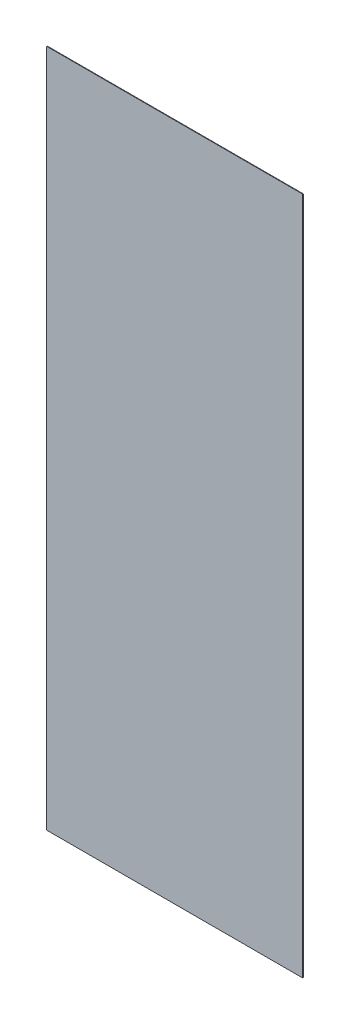
ISO-10303-21;
HEADER;
FILE_DESCRIPTION(('STEP AP214'),'2;1');
FILE_NAME('part.step','',(''),(''),'','','');
FILE_SCHEMA(('AUTOMOTIVE_DESIGN { 1 0 10303 214 1 1 1 1 }'));
ENDSEC;
DATA;
#1=APPLICATION_CONTEXT('core data for automotive mechanical design processes');
#2=APPLICATION_PROTOCOL_DEFINITION('international standard','automotive_design',2000,#1);
#3=PRODUCT_CONTEXT('',#1,'mechanical');
#4=PRODUCT('Part','Part','',(#3));
#5=PRODUCT_RELATED_PRODUCT_CATEGORY('part','',(#4));
#6=PRODUCT_DEFINITION_FORMATION('','',#4);
#7=PRODUCT_DEFINITION_CONTEXT('part definition',#1,'design');
#8=PRODUCT_DEFINITION('design','',#6,#7);
#9=PRODUCT_DEFINITION_SHAPE('','',#8);
#10=(LENGTH_UNIT() NAMED_UNIT(*) SI_UNIT(.MILLI.,.METRE.));
#11=(NAMED_UNIT(*) PLANE_ANGLE_UNIT() SI_UNIT($,.RADIAN.));
#12=(NAMED_UNIT(*) SI_UNIT($,.STERADIAN.) SOLID_ANGLE_UNIT());
#13=UNCERTAINTY_MEASURE_WITH_UNIT(LENGTH_MEASURE(1.E-05),#10,'distance_accuracy_value','');
#14=(GEOMETRIC_REPRESENTATION_CONTEXT(3) GLOBAL_UNCERTAINTY_ASSIGNED_CONTEXT((#13)) GLOBAL_UNIT_ASSIGNED_CONTEXT((#10,
#11,#12)) REPRESENTATION_CONTEXT('',''));
#15=CARTESIAN_POINT('',(0.,0.,0.));
#16=DIRECTION('',(0.,0.,1.));
#17=DIRECTION('',(1.,0.,0.));
#18=AXIS2_PLACEMENT_3D('',#15,#16,#17);
#19=CARTESIAN_POINT('',(1.5,120.,-820.));
#20=DIRECTION('',(-1.,0.,0.));
#21=DIRECTION('',(0.,0.,1.));
#22=AXIS2_PLACEMENT_3D('',#19,#20,#21);
#23=PLANE('',#22);
#24=DIRECTION('',(0.,-1.,0.));
#25=VECTOR('',#24,1.);
#26=CARTESIAN_POINT('',(1.5,120.,-818.5));
#27=LINE('',#26,#25);
#28=CARTESIAN_POINT('',(1.5,1968.5,-818.5));
#29=VERTEX_POINT('',#28);
#30=CARTESIAN_POINT('',(1.5,120.,-818.5));
#31=VERTEX_POINT('',#30);
#32=EDGE_CURVE('E103',#29,#31,#27,.T.);
#33=ORIENTED_EDGE('',*,*,#32,.F.);
#34=DIRECTION('',(0.,0.,1.));
#35=VECTOR('',#34,1.);
#36=CARTESIAN_POINT('',(1.5,1968.5,-820.));
#37=LINE('',#36,#35);
#38=CARTESIAN_POINT('',(1.5,1968.5,-820.));
#39=VERTEX_POINT('',#38);
#40=EDGE_CURVE('E11',#39,#29,#37,.T.);
#41=ORIENTED_EDGE('',*,*,#40,.F.);
#42=DIRECTION('',(0.,-1.,0.));
#43=VECTOR('',#42,1.);
#44=CARTESIAN_POINT('',(1.5,120.,-820.));
#45=LINE('',#44,#43);
#46=CARTESIAN_POINT('',(1.5,120.,-820.));
#47=VERTEX_POINT('',#46);
#48=EDGE_CURVE('E97',#39,#47,#45,.T.);
#49=ORIENTED_EDGE('',*,*,#48,.T.);
#50=DIRECTION('',(0.,0.,1.));
#51=VECTOR('',#50,1.);
#52=CARTESIAN_POINT('',(1.5,120.,-820.));
#53=LINE('',#52,#51);
#54=EDGE_CURVE('E42',#47,#31,#53,.T.);
#55=ORIENTED_EDGE('',*,*,#54,.T.);
#56=EDGE_LOOP('',(#33,#41,#49,#55));
#57=FACE_BOUND('',#56,.T.);
#58=ADVANCED_FACE('F39',(#57),#23,.T.);
#59=CARTESIAN_POINT('',(1.5,1968.5,-820.));
#60=DIRECTION('',(0.,1.,0.));
#61=DIRECTION('',(0.,0.,1.));
#62=AXIS2_PLACEMENT_3D('',#59,#60,#61);
#63=PLANE('',#62);
#64=DIRECTION('',(-1.,0.,0.));
#65=VECTOR('',#64,1.);
#66=CARTESIAN_POINT('',(1.5,1968.5,-818.5));
#67=LINE('',#66,#65);
#68=CARTESIAN_POINT('',(698.5,1968.5,-818.5));
#69=VERTEX_POINT('',#68);
#70=EDGE_CURVE('E99',#69,#29,#67,.T.);
#71=ORIENTED_EDGE('',*,*,#70,.F.);
#72=DIRECTION('',(0.,0.,1.));
#73=VECTOR('',#72,1.);
#74=CARTESIAN_POINT('',(698.5,1968.5,-820.));
#75=LINE('',#74,#73);
#76=CARTESIAN_POINT('',(698.5,1968.5,-820.));
#77=VERTEX_POINT('',#76);
#78=EDGE_CURVE('E48',#77,#69,#75,.T.);
#79=ORIENTED_EDGE('',*,*,#78,.F.);
#80=DIRECTION('',(-1.,0.,0.));
#81=VECTOR('',#80,1.);
#82=CARTESIAN_POINT('',(1.5,1968.5,-820.));
#83=LINE('',#82,#81);
#84=EDGE_CURVE('E94',#77,#39,#83,.T.);
#85=ORIENTED_EDGE('',*,*,#84,.T.);
#86=ORIENTED_EDGE('',*,*,#40,.T.);
#87=EDGE_LOOP('',(#71,#79,#85,#86));
#88=FACE_BOUND('',#87,.T.);
#89=ADVANCED_FACE('F113',(#88),#63,.T.);
#90=CARTESIAN_POINT('',(698.5,120.,-820.));
#91=DIRECTION('',(1.,0.,0.));
#92=DIRECTION('',(0.,0.,-1.));
#93=AXIS2_PLACEMENT_3D('',#90,#91,#92);
#94=PLANE('',#93);
#95=DIRECTION('',(0.,1.,0.));
#96=VECTOR('',#95,1.);
#97=CARTESIAN_POINT('',(698.5,120.,-818.5));
#98=LINE('',#97,#96);
#99=CARTESIAN_POINT('',(698.5,120.,-818.5));
#100=VERTEX_POINT('',#99);
#101=EDGE_CURVE('E89',#100,#69,#98,.T.);
#102=ORIENTED_EDGE('',*,*,#101,.F.);
#103=DIRECTION('',(0.,0.,1.));
#104=VECTOR('',#103,1.);
#105=CARTESIAN_POINT('',(698.5,120.,-820.));
#106=LINE('',#105,#104);
#107=CARTESIAN_POINT('',(698.5,120.,-820.));
#108=VERTEX_POINT('',#107);
#109=EDGE_CURVE('E84',#108,#100,#106,.T.);
#110=ORIENTED_EDGE('',*,*,#109,.F.);
#111=DIRECTION('',(0.,1.,0.));
#112=VECTOR('',#111,1.);
#113=CARTESIAN_POINT('',(698.5,120.,-820.));
#114=LINE('',#113,#112);
#115=EDGE_CURVE('E87',#108,#77,#114,.T.);
#116=ORIENTED_EDGE('',*,*,#115,.T.);
#117=ORIENTED_EDGE('',*,*,#78,.T.);
#118=EDGE_LOOP('',(#102,#110,#116,#117));
#119=FACE_BOUND('',#118,.T.);
#120=ADVANCED_FACE('F86',(#119),#94,.T.);
#121=CARTESIAN_POINT('',(1.5,120.,-820.));
#122=DIRECTION('',(0.,-1.,0.));
#123=DIRECTION('',(0.,0.,-1.));
#124=AXIS2_PLACEMENT_3D('',#121,#122,#123);
#125=PLANE('',#124);
#126=DIRECTION('',(1.,0.,0.));
#127=VECTOR('',#126,1.);
#128=CARTESIAN_POINT('',(1.5,120.,-818.5));
#129=LINE('',#128,#127);
#130=EDGE_CURVE('E106',#31,#100,#129,.T.);
#131=ORIENTED_EDGE('',*,*,#130,.F.);
#132=ORIENTED_EDGE('',*,*,#54,.F.);
#133=DIRECTION('',(1.,0.,0.));
#134=VECTOR('',#133,1.);
#135=CARTESIAN_POINT('',(1.5,120.,-820.));
#136=LINE('',#135,#134);
#137=EDGE_CURVE('E93',#47,#108,#136,.T.);
#138=ORIENTED_EDGE('',*,*,#137,.T.);
#139=ORIENTED_EDGE('',*,*,#109,.T.);
#140=EDGE_LOOP('',(#131,#132,#138,#139));
#141=FACE_BOUND('',#140,.T.);
#142=ADVANCED_FACE('F96',(#141),#125,.T.);
#143=CARTESIAN_POINT('',(0.,0.,-820.));
#144=DIRECTION('',(0.,0.,-1.));
#145=DIRECTION('',(-1.,0.,0.));
#146=AXIS2_PLACEMENT_3D('',#143,#144,#145);
#147=PLANE('',#146);
#148=ORIENTED_EDGE('',*,*,#48,.F.);
#149=ORIENTED_EDGE('',*,*,#84,.F.);
#150=ORIENTED_EDGE('',*,*,#115,.F.);
#151=ORIENTED_EDGE('',*,*,#137,.F.);
#152=EDGE_LOOP('',(#148,#149,#150,#151));
#153=FACE_BOUND('',#152,.T.);
#154=ADVANCED_FACE('F92',(#153),#147,.T.);
#155=CARTESIAN_POINT('',(0.,0.,-818.5));
#156=DIRECTION('',(0.,0.,-1.));
#157=DIRECTION('',(-1.,0.,0.));
#158=AXIS2_PLACEMENT_3D('',#155,#156,#157);
#159=PLANE('',#158);
#160=ORIENTED_EDGE('',*,*,#32,.T.);
#161=ORIENTED_EDGE('',*,*,#130,.T.);
#162=ORIENTED_EDGE('',*,*,#101,.T.);
#163=ORIENTED_EDGE('',*,*,#70,.T.);
#164=EDGE_LOOP('',(#160,#161,#162,#163));
#165=FACE_BOUND('',#164,.T.);
#166=ADVANCED_FACE('F112',(#165),#159,.F.);
#167=CLOSED_SHELL('',(#58,#89,#120,#142,#154,#166));
#168=MANIFOLD_SOLID_BREP('B2',#167);
#169=ADVANCED_BREP_SHAPE_REPRESENTATION('',(#18,#168),#14);
#170=SHAPE_DEFINITION_REPRESENTATION(#9,#169);
ENDSEC;
END-ISO-10303-21;
